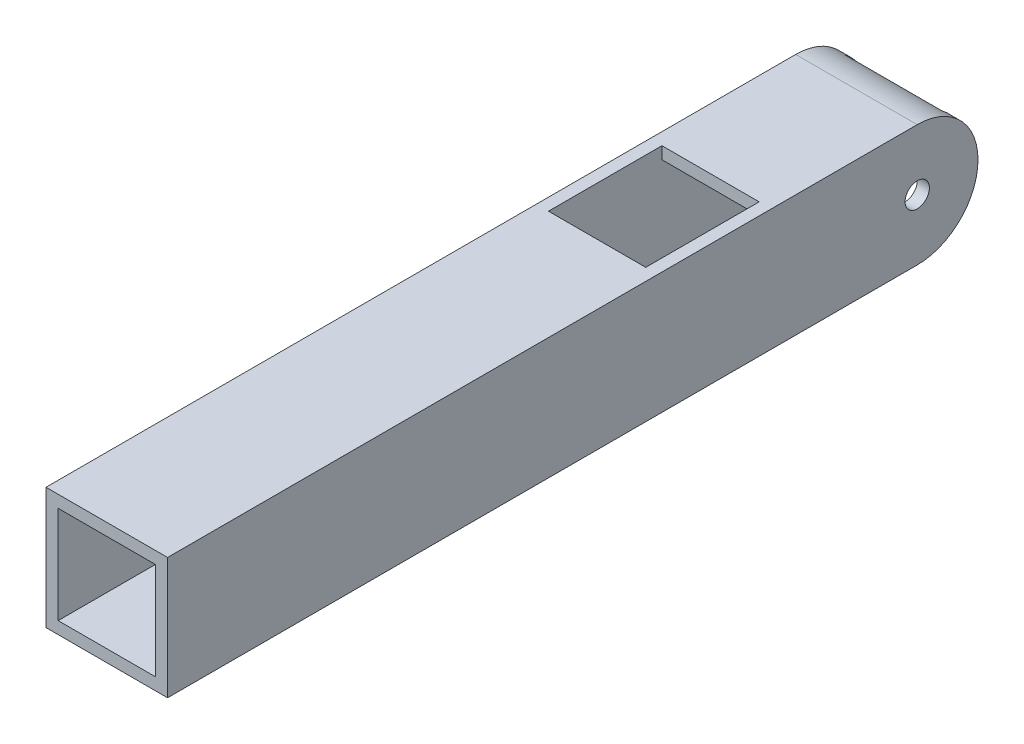
ISO-10303-21;
HEADER;
FILE_DESCRIPTION(('STEP AP214'),'2;1');
FILE_NAME('part.step','',(''),(''),'','','');
FILE_SCHEMA(('AUTOMOTIVE_DESIGN { 1 0 10303 214 1 1 1 1 }'));
ENDSEC;
DATA;
#1=APPLICATION_CONTEXT('core data for automotive mechanical design processes');
#2=APPLICATION_PROTOCOL_DEFINITION('international standard','automotive_design',2000,#1);
#3=PRODUCT_CONTEXT('',#1,'mechanical');
#4=PRODUCT('Part','Part','',(#3));
#5=PRODUCT_RELATED_PRODUCT_CATEGORY('part','',(#4));
#6=PRODUCT_DEFINITION_FORMATION('','',#4);
#7=PRODUCT_DEFINITION_CONTEXT('part definition',#1,'design');
#8=PRODUCT_DEFINITION('design','',#6,#7);
#9=PRODUCT_DEFINITION_SHAPE('','',#8);
#10=(LENGTH_UNIT() NAMED_UNIT(*) SI_UNIT(.MILLI.,.METRE.));
#11=(NAMED_UNIT(*) PLANE_ANGLE_UNIT() SI_UNIT($,.RADIAN.));
#12=(NAMED_UNIT(*) SI_UNIT($,.STERADIAN.) SOLID_ANGLE_UNIT());
#13=UNCERTAINTY_MEASURE_WITH_UNIT(LENGTH_MEASURE(1.E-05),#10,'distance_accuracy_value','');
#14=(GEOMETRIC_REPRESENTATION_CONTEXT(3) GLOBAL_UNCERTAINTY_ASSIGNED_CONTEXT((#13)) GLOBAL_UNIT_ASSIGNED_CONTEXT((#10,
#11,#12)) REPRESENTATION_CONTEXT('',''));
#15=CARTESIAN_POINT('',(0.,0.,0.));
#16=DIRECTION('',(0.,0.,1.));
#17=DIRECTION('',(1.,0.,0.));
#18=AXIS2_PLACEMENT_3D('',#15,#16,#17);
#19=CARTESIAN_POINT('',(-6.,6.00000000000001,0.));
#20=DIRECTION('',(0.,1.,0.));
#21=DIRECTION('',(0.,0.,1.));
#22=AXIS2_PLACEMENT_3D('',#19,#20,#21);
#23=PLANE('',#22);
#24=DIRECTION('',(0.,0.,1.));
#25=VECTOR('',#24,1.);
#26=CARTESIAN_POINT('',(6.,6.00000000000001,0.));
#27=LINE('',#26,#25);
#28=CARTESIAN_POINT('',(6.,6.00000000000001,3.00000000000001));
#29=VERTEX_POINT('',#28);
#30=CARTESIAN_POINT('',(6.,6.00000000000001,25.5));
#31=VERTEX_POINT('',#30);
#32=EDGE_CURVE('E192',#29,#31,#27,.T.);
#33=ORIENTED_EDGE('',*,*,#32,.T.);
#34=DIRECTION('',(-1.,0.,0.));
#35=VECTOR('',#34,1.);
#36=CARTESIAN_POINT('',(-6.,6.00000000000001,25.5));
#37=LINE('',#36,#35);
#38=CARTESIAN_POINT('',(-6.,6.00000000000001,25.5));
#39=VERTEX_POINT('',#38);
#40=EDGE_CURVE('E11',#31,#39,#37,.T.);
#41=ORIENTED_EDGE('',*,*,#40,.T.);
#42=DIRECTION('',(0.,0.,1.));
#43=VECTOR('',#42,1.);
#44=CARTESIAN_POINT('',(-6.,6.00000000000001,0.));
#45=LINE('',#44,#43);
#46=CARTESIAN_POINT('',(-6.,6.00000000000001,3.00000000000001));
#47=VERTEX_POINT('',#46);
#48=EDGE_CURVE('E188',#47,#39,#45,.T.);
#49=ORIENTED_EDGE('',*,*,#48,.F.);
#50=DIRECTION('',(1.,0.,0.));
#51=VECTOR('',#50,1.);
#52=CARTESIAN_POINT('',(-6.,6.00000000000001,3.00000000000001));
#53=LINE('',#52,#51);
#54=EDGE_CURVE('E239',#47,#29,#53,.T.);
#55=ORIENTED_EDGE('',*,*,#54,.T.);
#56=EDGE_LOOP('',(#33,#41,#49,#55));
#57=FACE_BOUND('',#56,.T.);
#58=ADVANCED_FACE('F30',(#57),#23,.F.);
#59=CARTESIAN_POINT('',(7.5,-7.49999999999999,100.));
#60=DIRECTION('',(-1.,0.,0.));
#61=DIRECTION('',(0.,0.,1.));
#62=AXIS2_PLACEMENT_3D('',#59,#60,#61);
#63=PLANE('',#62);
#64=CARTESIAN_POINT('',(7.5,0.,7.50000000000001));
#65=DIRECTION('',(1.,0.,0.));
#66=DIRECTION('',(0.,0.,-1.));
#67=AXIS2_PLACEMENT_3D('',#64,#65,#66);
#68=CIRCLE('',#67,1.5);
#69=CARTESIAN_POINT('',(7.5,0.,6.00000000000001));
#70=VERTEX_POINT('',#69);
#71=EDGE_CURVE('E158',#70,#70,#68,.T.);
#72=ORIENTED_EDGE('',*,*,#71,.F.);
#73=EDGE_LOOP('',(#72));
#74=FACE_BOUND('',#73,.T.);
#75=DIRECTION('',(0.,0.,-1.));
#76=VECTOR('',#75,1.);
#77=CARTESIAN_POINT('',(7.5,-7.49999999999999,100.));
#78=LINE('',#77,#76);
#79=CARTESIAN_POINT('',(7.5,-7.49999999999999,100.));
#80=VERTEX_POINT('',#79);
#81=CARTESIAN_POINT('',(7.5,-7.49999999999999,7.50000000000001));
#82=VERTEX_POINT('',#81);
#83=EDGE_CURVE('E203',#80,#82,#78,.T.);
#84=ORIENTED_EDGE('',*,*,#83,.T.);
#85=CARTESIAN_POINT('',(7.5,0.,7.50000000000001));
#86=DIRECTION('',(-1.,0.,0.));
#87=DIRECTION('',(0.,0.,1.));
#88=AXIS2_PLACEMENT_3D('',#85,#86,#87);
#89=CIRCLE('',#88,7.5);
#90=CARTESIAN_POINT('',(7.5,0.,0.));
#91=VERTEX_POINT('',#90);
#92=EDGE_CURVE('E220',#82,#91,#89,.F.);
#93=ORIENTED_EDGE('',*,*,#92,.T.);
#94=CARTESIAN_POINT('',(7.5,0.,7.50000000000001));
#95=DIRECTION('',(-1.,0.,0.));
#96=DIRECTION('',(0.,0.,1.));
#97=AXIS2_PLACEMENT_3D('',#94,#95,#96);
#98=CIRCLE('',#97,7.5);
#99=CARTESIAN_POINT('',(7.5,7.50000000000001,7.50000000000001));
#100=VERTEX_POINT('',#99);
#101=EDGE_CURVE('E218',#91,#100,#98,.F.);
#102=ORIENTED_EDGE('',*,*,#101,.T.);
#103=DIRECTION('',(0.,0.,-1.));
#104=VECTOR('',#103,1.);
#105=CARTESIAN_POINT('',(7.5,7.50000000000001,100.));
#106=LINE('',#105,#104);
#107=CARTESIAN_POINT('',(7.5,7.50000000000001,100.));
#108=VERTEX_POINT('',#107);
#109=EDGE_CURVE('E212',#108,#100,#106,.T.);
#110=ORIENTED_EDGE('',*,*,#109,.F.);
#111=DIRECTION('',(0.,1.,0.));
#112=VECTOR('',#111,1.);
#113=CARTESIAN_POINT('',(7.5,-7.49999999999999,100.));
#114=LINE('',#113,#112);
#115=EDGE_CURVE('E185',#80,#108,#114,.T.);
#116=ORIENTED_EDGE('',*,*,#115,.F.);
#117=EDGE_LOOP('',(#84,#93,#102,#110,#116));
#118=FACE_BOUND('',#117,.T.);
#119=ADVANCED_FACE('F289',(#74,#118),#63,.F.);
#120=CARTESIAN_POINT('',(-7.5,7.50000000000001,100.));
#121=DIRECTION('',(0.,-1.,0.));
#122=DIRECTION('',(0.,0.,-1.));
#123=AXIS2_PLACEMENT_3D('',#120,#121,#122);
#124=PLANE('',#123);
#125=DIRECTION('',(1.,0.,0.));
#126=VECTOR('',#125,1.);
#127=CARTESIAN_POINT('',(6.00000000000001,7.50000000000001,39.5));
#128=LINE('',#127,#126);
#129=CARTESIAN_POINT('',(-5.99999999999999,7.50000000000001,39.5));
#130=VERTEX_POINT('',#129);
#131=CARTESIAN_POINT('',(6.00000000000001,7.50000000000001,39.5));
#132=VERTEX_POINT('',#131);
#133=EDGE_CURVE('E144',#130,#132,#128,.T.);
#134=ORIENTED_EDGE('',*,*,#133,.F.);
#135=DIRECTION('',(0.,0.,1.));
#136=VECTOR('',#135,1.);
#137=CARTESIAN_POINT('',(-5.99999999999999,7.50000000000001,39.5));
#138=LINE('',#137,#136);
#139=CARTESIAN_POINT('',(-6.,7.50000000000001,25.5));
#140=VERTEX_POINT('',#139);
#141=EDGE_CURVE('E45',#140,#130,#138,.T.);
#142=ORIENTED_EDGE('',*,*,#141,.F.);
#143=DIRECTION('',(-1.,0.,0.));
#144=VECTOR('',#143,1.);
#145=CARTESIAN_POINT('',(6.,7.50000000000001,25.5));
#146=LINE('',#145,#144);
#147=CARTESIAN_POINT('',(6.,7.50000000000001,25.5));
#148=VERTEX_POINT('',#147);
#149=EDGE_CURVE('E151',#148,#140,#146,.T.);
#150=ORIENTED_EDGE('',*,*,#149,.F.);
#151=DIRECTION('',(0.,0.,-1.));
#152=VECTOR('',#151,1.);
#153=CARTESIAN_POINT('',(6.00000000000001,7.50000000000001,39.5));
#154=LINE('',#153,#152);
#155=EDGE_CURVE('E136',#132,#148,#154,.T.);
#156=ORIENTED_EDGE('',*,*,#155,.F.);
#157=EDGE_LOOP('',(#134,#142,#150,#156));
#158=FACE_BOUND('',#157,.T.);
#159=ORIENTED_EDGE('',*,*,#109,.T.);
#160=DIRECTION('',(-1.,0.,0.));
#161=VECTOR('',#160,1.);
#162=CARTESIAN_POINT('',(-7.5,7.50000000000001,7.50000000000001));
#163=LINE('',#162,#161);
#164=CARTESIAN_POINT('',(-7.5,7.50000000000001,7.50000000000001));
#165=VERTEX_POINT('',#164);
#166=EDGE_CURVE('E237',#100,#165,#163,.T.);
#167=ORIENTED_EDGE('',*,*,#166,.T.);
#168=DIRECTION('',(0.,0.,-1.));
#169=VECTOR('',#168,1.);
#170=CARTESIAN_POINT('',(-7.5,7.50000000000001,100.));
#171=LINE('',#170,#169);
#172=CARTESIAN_POINT('',(-7.5,7.50000000000001,100.));
#173=VERTEX_POINT('',#172);
#174=EDGE_CURVE('E209',#173,#165,#171,.T.);
#175=ORIENTED_EDGE('',*,*,#174,.F.);
#176=DIRECTION('',(-1.,0.,0.));
#177=VECTOR('',#176,1.);
#178=CARTESIAN_POINT('',(-7.5,7.50000000000001,100.));
#179=LINE('',#178,#177);
#180=EDGE_CURVE('E197',#108,#173,#179,.T.);
#181=ORIENTED_EDGE('',*,*,#180,.F.);
#182=EDGE_LOOP('',(#159,#167,#175,#181));
#183=FACE_BOUND('',#182,.T.);
#184=ADVANCED_FACE('F148',(#158,#183),#124,.F.);
#185=CARTESIAN_POINT('',(-7.5,-7.49999999999999,100.));
#186=DIRECTION('',(1.,0.,0.));
#187=DIRECTION('',(0.,0.,-1.));
#188=AXIS2_PLACEMENT_3D('',#185,#186,#187);
#189=PLANE('',#188);
#190=CARTESIAN_POINT('',(-7.5,0.,7.50000000000001));
#191=DIRECTION('',(1.,0.,0.));
#192=DIRECTION('',(0.,0.,-1.));
#193=AXIS2_PLACEMENT_3D('',#190,#191,#192);
#194=CIRCLE('',#193,1.5);
#195=CARTESIAN_POINT('',(-7.5,0.,6.00000000000001));
#196=VERTEX_POINT('',#195);
#197=EDGE_CURVE('E161',#196,#196,#194,.T.);
#198=ORIENTED_EDGE('',*,*,#197,.T.);
#199=EDGE_LOOP('',(#198));
#200=FACE_BOUND('',#199,.T.);
#201=CARTESIAN_POINT('',(-7.5,0.,7.50000000000001));
#202=DIRECTION('',(1.,0.,0.));
#203=DIRECTION('',(0.,0.,-1.));
#204=AXIS2_PLACEMENT_3D('',#201,#202,#203);
#205=CIRCLE('',#204,7.5);
#206=CARTESIAN_POINT('',(-7.5,0.,0.));
#207=VERTEX_POINT('',#206);
#208=EDGE_CURVE('E233',#165,#207,#205,.F.);
#209=ORIENTED_EDGE('',*,*,#208,.T.);
#210=CARTESIAN_POINT('',(-7.5,0.,7.50000000000001));
#211=DIRECTION('',(1.,0.,0.));
#212=DIRECTION('',(0.,0.,-1.));
#213=AXIS2_PLACEMENT_3D('',#210,#211,#212);
#214=CIRCLE('',#213,7.5);
#215=CARTESIAN_POINT('',(-7.5,-7.49999999999999,7.50000000000001));
#216=VERTEX_POINT('',#215);
#217=EDGE_CURVE('E235',#207,#216,#214,.F.);
#218=ORIENTED_EDGE('',*,*,#217,.T.);
#219=DIRECTION('',(0.,0.,-1.));
#220=VECTOR('',#219,1.);
#221=CARTESIAN_POINT('',(-7.5,-7.49999999999999,100.));
#222=LINE('',#221,#220);
#223=CARTESIAN_POINT('',(-7.5,-7.49999999999999,100.));
#224=VERTEX_POINT('',#223);
#225=EDGE_CURVE('E206',#224,#216,#222,.T.);
#226=ORIENTED_EDGE('',*,*,#225,.F.);
#227=DIRECTION('',(0.,-1.,0.));
#228=VECTOR('',#227,1.);
#229=CARTESIAN_POINT('',(-7.5,-7.49999999999999,100.));
#230=LINE('',#229,#228);
#231=EDGE_CURVE('E199',#173,#224,#230,.T.);
#232=ORIENTED_EDGE('',*,*,#231,.F.);
#233=ORIENTED_EDGE('',*,*,#174,.T.);
#234=EDGE_LOOP('',(#209,#218,#226,#232,#233));
#235=FACE_BOUND('',#234,.T.);
#236=ADVANCED_FACE('F294',(#200,#235),#189,.F.);
#237=CARTESIAN_POINT('',(-7.5,-7.49999999999999,100.));
#238=DIRECTION('',(0.,1.,0.));
#239=DIRECTION('',(0.,0.,1.));
#240=AXIS2_PLACEMENT_3D('',#237,#238,#239);
#241=PLANE('',#240);
#242=ORIENTED_EDGE('',*,*,#225,.T.);
#243=DIRECTION('',(1.,0.,0.));
#244=VECTOR('',#243,1.);
#245=CARTESIAN_POINT('',(7.5,-7.49999999999999,7.50000000000001));
#246=LINE('',#245,#244);
#247=EDGE_CURVE('E215',#216,#82,#246,.T.);
#248=ORIENTED_EDGE('',*,*,#247,.T.);
#249=ORIENTED_EDGE('',*,*,#83,.F.);
#250=DIRECTION('',(1.,0.,0.));
#251=VECTOR('',#250,1.);
#252=CARTESIAN_POINT('',(-7.5,-7.49999999999999,100.));
#253=LINE('',#252,#251);
#254=EDGE_CURVE('E201',#224,#80,#253,.T.);
#255=ORIENTED_EDGE('',*,*,#254,.F.);
#256=EDGE_LOOP('',(#242,#248,#249,#255));
#257=FACE_BOUND('',#256,.T.);
#258=ADVANCED_FACE('F285',(#257),#241,.F.);
#259=CARTESIAN_POINT('',(7.5,7.50000000000001,100.));
#260=DIRECTION('',(0.,0.,-1.));
#261=DIRECTION('',(-1.,0.,0.));
#262=AXIS2_PLACEMENT_3D('',#259,#260,#261);
#263=PLANE('',#262);
#264=DIRECTION('',(-1.,0.,0.));
#265=VECTOR('',#264,1.);
#266=CARTESIAN_POINT('',(-6.,6.00000000000001,100.));
#267=LINE('',#266,#265);
#268=CARTESIAN_POINT('',(6.,6.00000000000001,100.));
#269=VERTEX_POINT('',#268);
#270=CARTESIAN_POINT('',(-6.,6.00000000000001,100.));
#271=VERTEX_POINT('',#270);
#272=EDGE_CURVE('E173',#269,#271,#267,.T.);
#273=ORIENTED_EDGE('',*,*,#272,.F.);
#274=DIRECTION('',(0.,1.,0.));
#275=VECTOR('',#274,1.);
#276=CARTESIAN_POINT('',(6.,-6.00000000000001,100.));
#277=LINE('',#276,#275);
#278=CARTESIAN_POINT('',(6.,-6.00000000000001,100.));
#279=VERTEX_POINT('',#278);
#280=EDGE_CURVE('E171',#279,#269,#277,.T.);
#281=ORIENTED_EDGE('',*,*,#280,.F.);
#282=DIRECTION('',(1.,0.,0.));
#283=VECTOR('',#282,1.);
#284=CARTESIAN_POINT('',(-6.,-6.00000000000001,100.));
#285=LINE('',#284,#283);
#286=CARTESIAN_POINT('',(-6.,-6.00000000000001,100.));
#287=VERTEX_POINT('',#286);
#288=EDGE_CURVE('E180',#287,#279,#285,.T.);
#289=ORIENTED_EDGE('',*,*,#288,.F.);
#290=DIRECTION('',(0.,-1.,0.));
#291=VECTOR('',#290,1.);
#292=CARTESIAN_POINT('',(-6.,-6.00000000000001,100.));
#293=LINE('',#292,#291);
#294=EDGE_CURVE('E177',#271,#287,#293,.T.);
#295=ORIENTED_EDGE('',*,*,#294,.F.);
#296=EDGE_LOOP('',(#273,#281,#289,#295));
#297=FACE_BOUND('',#296,.T.);
#298=ORIENTED_EDGE('',*,*,#115,.T.);
#299=ORIENTED_EDGE('',*,*,#180,.T.);
#300=ORIENTED_EDGE('',*,*,#231,.T.);
#301=ORIENTED_EDGE('',*,*,#254,.T.);
#302=EDGE_LOOP('',(#298,#299,#300,#301));
#303=FACE_BOUND('',#302,.T.);
#304=ADVANCED_FACE('F257',(#297,#303),#263,.F.);
#305=CARTESIAN_POINT('',(6.,-6.00000000000001,0.));
#306=DIRECTION('',(1.,0.,0.));
#307=DIRECTION('',(0.,0.,-1.));
#308=AXIS2_PLACEMENT_3D('',#305,#306,#307);
#309=PLANE('',#308);
#310=DIRECTION('',(0.,1.,0.));
#311=VECTOR('',#310,1.);
#312=CARTESIAN_POINT('',(6.,4.50000000000001,25.5));
#313=LINE('',#312,#311);
#314=EDGE_CURVE('E140',#31,#148,#313,.T.);
#315=ORIENTED_EDGE('',*,*,#314,.F.);
#316=ORIENTED_EDGE('',*,*,#32,.F.);
#317=CARTESIAN_POINT('',(6.,0.,7.50000000000001));
#318=DIRECTION('',(1.,0.,0.));
#319=DIRECTION('',(0.,0.,-1.));
#320=AXIS2_PLACEMENT_3D('',#317,#318,#319);
#321=CIRCLE('',#320,7.5);
#322=CARTESIAN_POINT('',(6.,0.,0.));
#323=VERTEX_POINT('',#322);
#324=EDGE_CURVE('E222',#29,#323,#321,.F.);
#325=ORIENTED_EDGE('',*,*,#324,.T.);
#326=CARTESIAN_POINT('',(6.,0.,7.50000000000001));
#327=DIRECTION('',(1.,0.,0.));
#328=DIRECTION('',(0.,0.,-1.));
#329=AXIS2_PLACEMENT_3D('',#326,#327,#328);
#330=CIRCLE('',#329,7.5);
#331=CARTESIAN_POINT('',(6.,-6.00000000000001,3.00000000000002));
#332=VERTEX_POINT('',#331);
#333=EDGE_CURVE('E224',#323,#332,#330,.F.);
#334=ORIENTED_EDGE('',*,*,#333,.T.);
#335=DIRECTION('',(0.,0.,1.));
#336=VECTOR('',#335,1.);
#337=CARTESIAN_POINT('',(6.,-6.00000000000001,0.));
#338=LINE('',#337,#336);
#339=EDGE_CURVE('E183',#332,#279,#338,.T.);
#340=ORIENTED_EDGE('',*,*,#339,.T.);
#341=ORIENTED_EDGE('',*,*,#280,.T.);
#342=CARTESIAN_POINT('',(6.,6.00000000000001,39.5));
#343=VERTEX_POINT('',#342);
#344=EDGE_CURVE('E139',#343,#269,#27,.T.);
#345=ORIENTED_EDGE('',*,*,#344,.F.);
#346=DIRECTION('',(0.,1.,0.));
#347=VECTOR('',#346,1.);
#348=CARTESIAN_POINT('',(6.00000000000001,4.50000000000001,39.5));
#349=LINE('',#348,#347);
#350=EDGE_CURVE('E53',#343,#132,#349,.T.);
#351=ORIENTED_EDGE('',*,*,#350,.T.);
#352=ORIENTED_EDGE('',*,*,#155,.T.);
#353=EDGE_LOOP('',(#315,#316,#325,#334,#340,#341,#345,#351,#352));
#354=FACE_BOUND('',#353,.T.);
#355=CARTESIAN_POINT('',(6.,0.,7.50000000000001));
#356=DIRECTION('',(1.,0.,0.));
#357=DIRECTION('',(0.,0.,-1.));
#358=AXIS2_PLACEMENT_3D('',#355,#356,#357);
#359=CIRCLE('',#358,1.5);
#360=CARTESIAN_POINT('',(6.,0.,6.00000000000001));
#361=VERTEX_POINT('',#360);
#362=EDGE_CURVE('E167',#361,#361,#359,.T.);
#363=ORIENTED_EDGE('',*,*,#362,.T.);
#364=EDGE_LOOP('',(#363));
#365=FACE_BOUND('',#364,.T.);
#366=ADVANCED_FACE('F133',(#354,#365),#309,.F.);
#367=CARTESIAN_POINT('',(-6.,-6.00000000000001,0.));
#368=DIRECTION('',(0.,-1.,0.));
#369=DIRECTION('',(0.,0.,-1.));
#370=AXIS2_PLACEMENT_3D('',#367,#368,#369);
#371=PLANE('',#370);
#372=ORIENTED_EDGE('',*,*,#339,.F.);
#373=DIRECTION('',(-1.,0.,0.));
#374=VECTOR('',#373,1.);
#375=CARTESIAN_POINT('',(6.,-6.00000000000001,3.00000000000002));
#376=LINE('',#375,#374);
#377=CARTESIAN_POINT('',(-6.,-6.,3.00000000000002));
#378=VERTEX_POINT('',#377);
#379=EDGE_CURVE('E227',#332,#378,#376,.T.);
#380=ORIENTED_EDGE('',*,*,#379,.T.);
#381=DIRECTION('',(0.,0.,1.));
#382=VECTOR('',#381,1.);
#383=CARTESIAN_POINT('',(-6.,-6.00000000000001,0.));
#384=LINE('',#383,#382);
#385=EDGE_CURVE('E186',#378,#287,#384,.T.);
#386=ORIENTED_EDGE('',*,*,#385,.T.);
#387=ORIENTED_EDGE('',*,*,#288,.T.);
#388=EDGE_LOOP('',(#372,#380,#386,#387));
#389=FACE_BOUND('',#388,.T.);
#390=ADVANCED_FACE('F261',(#389),#371,.F.);
#391=CARTESIAN_POINT('',(-6.,-6.00000000000001,0.));
#392=DIRECTION('',(-1.,0.,0.));
#393=DIRECTION('',(0.,0.,1.));
#394=AXIS2_PLACEMENT_3D('',#391,#392,#393);
#395=PLANE('',#394);
#396=DIRECTION('',(0.,1.,0.));
#397=VECTOR('',#396,1.);
#398=CARTESIAN_POINT('',(-5.99999999999999,4.50000000000001,39.5));
#399=LINE('',#398,#397);
#400=CARTESIAN_POINT('',(-5.99999999999999,6.00000000000001,39.5));
#401=VERTEX_POINT('',#400);
#402=EDGE_CURVE('E141',#401,#130,#399,.T.);
#403=ORIENTED_EDGE('',*,*,#402,.F.);
#404=EDGE_CURVE('E191',#401,#271,#45,.T.);
#405=ORIENTED_EDGE('',*,*,#404,.T.);
#406=ORIENTED_EDGE('',*,*,#294,.T.);
#407=ORIENTED_EDGE('',*,*,#385,.F.);
#408=CARTESIAN_POINT('',(-6.,0.,7.50000000000001));
#409=DIRECTION('',(-1.,0.,0.));
#410=DIRECTION('',(0.,0.,1.));
#411=AXIS2_PLACEMENT_3D('',#408,#409,#410);
#412=CIRCLE('',#411,7.5);
#413=CARTESIAN_POINT('',(-6.,0.,0.));
#414=VERTEX_POINT('',#413);
#415=EDGE_CURVE('E231',#378,#414,#412,.F.);
#416=ORIENTED_EDGE('',*,*,#415,.T.);
#417=CARTESIAN_POINT('',(-6.,0.,7.50000000000001));
#418=DIRECTION('',(-1.,0.,0.));
#419=DIRECTION('',(0.,0.,1.));
#420=AXIS2_PLACEMENT_3D('',#417,#418,#419);
#421=CIRCLE('',#420,7.5);
#422=EDGE_CURVE('E229',#414,#47,#421,.F.);
#423=ORIENTED_EDGE('',*,*,#422,.T.);
#424=ORIENTED_EDGE('',*,*,#48,.T.);
#425=DIRECTION('',(0.,1.,0.));
#426=VECTOR('',#425,1.);
#427=CARTESIAN_POINT('',(-6.,4.50000000000001,25.5));
#428=LINE('',#427,#426);
#429=EDGE_CURVE('E156',#39,#140,#428,.T.);
#430=ORIENTED_EDGE('',*,*,#429,.T.);
#431=ORIENTED_EDGE('',*,*,#141,.T.);
#432=EDGE_LOOP('',(#403,#405,#406,#407,#416,#423,#424,#430,#431));
#433=FACE_BOUND('',#432,.T.);
#434=CARTESIAN_POINT('',(-6.,0.,7.50000000000001));
#435=DIRECTION('',(-1.,0.,0.));
#436=DIRECTION('',(0.,0.,1.));
#437=AXIS2_PLACEMENT_3D('',#434,#435,#436);
#438=CIRCLE('',#437,1.5);
#439=CARTESIAN_POINT('',(-6.,0.,9.00000000000001));
#440=VERTEX_POINT('',#439);
#441=EDGE_CURVE('E164',#440,#440,#438,.T.);
#442=ORIENTED_EDGE('',*,*,#441,.T.);
#443=EDGE_LOOP('',(#442));
#444=FACE_BOUND('',#443,.T.);
#445=ADVANCED_FACE('F249',(#433,#444),#395,.F.);
#446=ORIENTED_EDGE('',*,*,#404,.F.);
#447=DIRECTION('',(1.,0.,0.));
#448=VECTOR('',#447,1.);
#449=CARTESIAN_POINT('',(-6.,6.00000000000001,39.5));
#450=LINE('',#449,#448);
#451=EDGE_CURVE('E38',#401,#343,#450,.T.);
#452=ORIENTED_EDGE('',*,*,#451,.T.);
#453=ORIENTED_EDGE('',*,*,#344,.T.);
#454=ORIENTED_EDGE('',*,*,#272,.T.);
#455=EDGE_LOOP('',(#446,#452,#453,#454));
#456=FACE_BOUND('',#455,.T.);
#457=ADVANCED_FACE('F248',(#456),#23,.F.);
#458=CARTESIAN_POINT('',(-7.5,0.,7.50000000000001));
#459=DIRECTION('',(1.,0.,0.));
#460=DIRECTION('',(0.,0.,-1.));
#461=AXIS2_PLACEMENT_3D('',#458,#459,#460);
#462=CYLINDRICAL_SURFACE('',#461,7.5);
#463=DIRECTION('',(-1.,0.,0.));
#464=VECTOR('',#463,1.);
#465=CARTESIAN_POINT('',(7.5,0.,0.));
#466=LINE('',#465,#464);
#467=EDGE_CURVE('E174',#323,#91,#466,.F.);
#468=ORIENTED_EDGE('',*,*,#467,.F.);
#469=ORIENTED_EDGE('',*,*,#324,.F.);
#470=ORIENTED_EDGE('',*,*,#54,.F.);
#471=ORIENTED_EDGE('',*,*,#422,.F.);
#472=DIRECTION('',(-1.,0.,0.));
#473=VECTOR('',#472,1.);
#474=CARTESIAN_POINT('',(7.5,0.,0.));
#475=LINE('',#474,#473);
#476=EDGE_CURVE('E170',#207,#414,#475,.F.);
#477=ORIENTED_EDGE('',*,*,#476,.F.);
#478=ORIENTED_EDGE('',*,*,#208,.F.);
#479=ORIENTED_EDGE('',*,*,#166,.F.);
#480=ORIENTED_EDGE('',*,*,#101,.F.);
#481=EDGE_LOOP('',(#468,#469,#470,#471,#477,#478,#479,#480));
#482=FACE_BOUND('',#481,.T.);
#483=ADVANCED_FACE('F32',(#482),#462,.T.);
#484=CARTESIAN_POINT('',(-7.5,0.,7.50000000000001));
#485=DIRECTION('',(-1.,0.,0.));
#486=DIRECTION('',(0.,0.,1.));
#487=AXIS2_PLACEMENT_3D('',#484,#485,#486);
#488=CYLINDRICAL_SURFACE('',#487,7.5);
#489=ORIENTED_EDGE('',*,*,#333,.F.);
#490=ORIENTED_EDGE('',*,*,#467,.T.);
#491=ORIENTED_EDGE('',*,*,#92,.F.);
#492=ORIENTED_EDGE('',*,*,#247,.F.);
#493=ORIENTED_EDGE('',*,*,#217,.F.);
#494=ORIENTED_EDGE('',*,*,#476,.T.);
#495=ORIENTED_EDGE('',*,*,#415,.F.);
#496=ORIENTED_EDGE('',*,*,#379,.F.);
#497=EDGE_LOOP('',(#489,#490,#491,#492,#493,#494,#495,#496));
#498=FACE_BOUND('',#497,.T.);
#499=ADVANCED_FACE('F266',(#498),#488,.T.);
#500=CARTESIAN_POINT('',(-7.5,0.,7.50000000000001));
#501=DIRECTION('',(1.,0.,0.));
#502=DIRECTION('',(0.,0.,-1.));
#503=AXIS2_PLACEMENT_3D('',#500,#501,#502);
#504=CYLINDRICAL_SURFACE('',#503,1.5);
#505=ORIENTED_EDGE('',*,*,#197,.F.);
#506=EDGE_LOOP('',(#505));
#507=FACE_BOUND('',#506,.T.);
#508=ORIENTED_EDGE('',*,*,#441,.F.);
#509=EDGE_LOOP('',(#508));
#510=FACE_BOUND('',#509,.T.);
#511=ADVANCED_FACE('F324',(#507,#510),#504,.F.);
#512=ORIENTED_EDGE('',*,*,#71,.T.);
#513=EDGE_LOOP('',(#512));
#514=FACE_BOUND('',#513,.T.);
#515=ORIENTED_EDGE('',*,*,#362,.F.);
#516=EDGE_LOOP('',(#515));
#517=FACE_BOUND('',#516,.T.);
#518=ADVANCED_FACE('F321',(#514,#517),#504,.F.);
#519=CARTESIAN_POINT('',(6.,4.50000000000001,25.5));
#520=DIRECTION('',(0.,0.,-1.));
#521=DIRECTION('',(-1.,0.,0.));
#522=AXIS2_PLACEMENT_3D('',#519,#520,#521);
#523=PLANE('',#522);
#524=ORIENTED_EDGE('',*,*,#314,.T.);
#525=ORIENTED_EDGE('',*,*,#149,.T.);
#526=ORIENTED_EDGE('',*,*,#429,.F.);
#527=ORIENTED_EDGE('',*,*,#40,.F.);
#528=EDGE_LOOP('',(#524,#525,#526,#527));
#529=FACE_BOUND('',#528,.T.);
#530=ADVANCED_FACE('F280',(#529),#523,.F.);
#531=CARTESIAN_POINT('',(6.00000000000001,4.50000000000001,39.5));
#532=DIRECTION('',(0.,0.,1.));
#533=DIRECTION('',(1.,0.,0.));
#534=AXIS2_PLACEMENT_3D('',#531,#532,#533);
#535=PLANE('',#534);
#536=ORIENTED_EDGE('',*,*,#402,.T.);
#537=ORIENTED_EDGE('',*,*,#133,.T.);
#538=ORIENTED_EDGE('',*,*,#350,.F.);
#539=ORIENTED_EDGE('',*,*,#451,.F.);
#540=EDGE_LOOP('',(#536,#537,#538,#539));
#541=FACE_BOUND('',#540,.T.);
#542=ADVANCED_FACE('F145',(#541),#535,.F.);
#543=CLOSED_SHELL('',(#58,#119,#184,#236,#258,#304,#366,#390,#445,#457,#483,#499,#511,#518,#530,#542));
#544=MANIFOLD_SOLID_BREP('B2',#543);
#545=ADVANCED_BREP_SHAPE_REPRESENTATION('',(#18,#544),#14);
#546=SHAPE_DEFINITION_REPRESENTATION(#9,#545);
ENDSEC;
END-ISO-10303-21;
